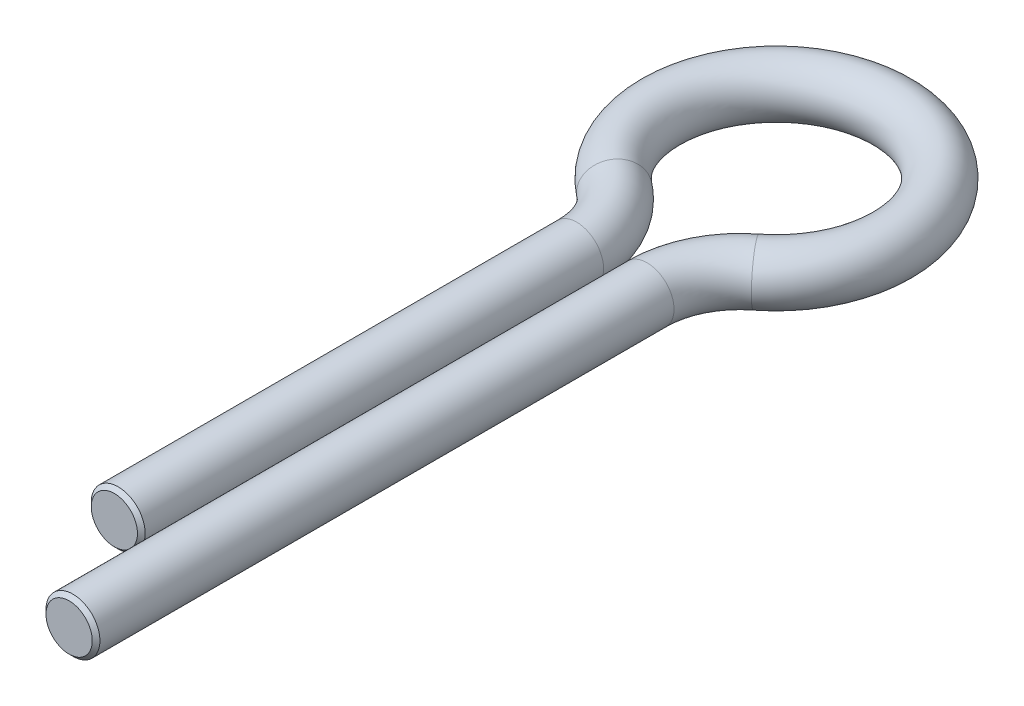
ISO-10303-21;
HEADER;
FILE_DESCRIPTION(('STEP AP214'),'2;1');
FILE_NAME('part.step','',(''),(''),'','','');
FILE_SCHEMA(('AUTOMOTIVE_DESIGN { 1 0 10303 214 1 1 1 1 }'));
ENDSEC;
DATA;
#1=APPLICATION_CONTEXT('core data for automotive mechanical design processes');
#2=APPLICATION_PROTOCOL_DEFINITION('international standard','automotive_design',2000,#1);
#3=PRODUCT_CONTEXT('',#1,'mechanical');
#4=PRODUCT('Part','Part','',(#3));
#5=PRODUCT_RELATED_PRODUCT_CATEGORY('part','',(#4));
#6=PRODUCT_DEFINITION_FORMATION('','',#4);
#7=PRODUCT_DEFINITION_CONTEXT('part definition',#1,'design');
#8=PRODUCT_DEFINITION('design','',#6,#7);
#9=PRODUCT_DEFINITION_SHAPE('','',#8);
#10=(LENGTH_UNIT() NAMED_UNIT(*) SI_UNIT(.MILLI.,.METRE.));
#11=(NAMED_UNIT(*) PLANE_ANGLE_UNIT() SI_UNIT($,.RADIAN.));
#12=(NAMED_UNIT(*) SI_UNIT($,.STERADIAN.) SOLID_ANGLE_UNIT());
#13=UNCERTAINTY_MEASURE_WITH_UNIT(LENGTH_MEASURE(1.E-05),#10,'distance_accuracy_value','');
#14=(GEOMETRIC_REPRESENTATION_CONTEXT(3) GLOBAL_UNCERTAINTY_ASSIGNED_CONTEXT((#13)) GLOBAL_UNIT_ASSIGNED_CONTEXT((#10,
#11,#12)) REPRESENTATION_CONTEXT('',''));
#15=CARTESIAN_POINT('',(0.,0.,0.));
#16=DIRECTION('',(0.,0.,1.));
#17=DIRECTION('',(1.,0.,0.));
#18=AXIS2_PLACEMENT_3D('',#15,#16,#17);
#19=CARTESIAN_POINT('',(0.912834636672157,0.,9.7742219057031));
#20=DIRECTION('',(0.,0.,-1.));
#21=DIRECTION('',(-1.,0.,0.));
#22=AXIS2_PLACEMENT_3D('',#19,#20,#21);
#23=PLANE('',#22);
#24=CARTESIAN_POINT('',(0.912834636672157,0.,9.7742219057031));
#25=DIRECTION('',(0.,0.,-1.));
#26=DIRECTION('',(-1.,0.,0.));
#27=AXIS2_PLACEMENT_3D('',#24,#25,#26);
#28=CIRCLE('',#27,0.599999999999996);
#29=CARTESIAN_POINT('',(0.312834636672161,0.,9.7742219057031));
#30=VERTEX_POINT('',#29);
#31=EDGE_CURVE('E10',#30,#30,#28,.F.);
#32=ORIENTED_EDGE('',*,*,#31,.T.);
#33=EDGE_LOOP('',(#32));
#34=FACE_BOUND('',#33,.T.);
#35=ADVANCED_FACE('F50',(#34),#23,.F.);
#36=CARTESIAN_POINT('',(-0.912834636672154,0.,6.77422190570311));
#37=DIRECTION('',(0.,0.,1.));
#38=DIRECTION('',(1.,0.,0.));
#39=AXIS2_PLACEMENT_3D('',#36,#37,#38);
#40=PLANE('',#39);
#41=CARTESIAN_POINT('',(-0.912834636672154,0.,6.77422190570311));
#42=DIRECTION('',(0.,0.,1.));
#43=DIRECTION('',(1.,0.,0.));
#44=AXIS2_PLACEMENT_3D('',#41,#42,#43);
#45=CIRCLE('',#44,0.600000000000003);
#46=CARTESIAN_POINT('',(-0.31283463667215,0.,6.77422190570311));
#47=VERTEX_POINT('',#46);
#48=EDGE_CURVE('E61',#47,#47,#45,.T.);
#49=ORIENTED_EDGE('',*,*,#48,.T.);
#50=EDGE_LOOP('',(#49));
#51=FACE_BOUND('',#50,.T.);
#52=ADVANCED_FACE('F108',(#51),#40,.T.);
#53=CARTESIAN_POINT('',(0.912834636672155,0.,-5.2257780942969));
#54=DIRECTION('',(0.,0.,1.));
#55=DIRECTION('',(1.,0.,0.));
#56=AXIS2_PLACEMENT_3D('',#53,#54,#55);
#57=CYLINDRICAL_SURFACE('',#56,0.7);
#58=CARTESIAN_POINT('',(0.912834636672157,0.,9.6742219057031));
#59=DIRECTION('',(0.,0.,-1.));
#60=DIRECTION('',(-1.,0.,0.));
#61=AXIS2_PLACEMENT_3D('',#58,#59,#60);
#62=CIRCLE('',#61,0.7);
#63=CARTESIAN_POINT('',(0.212834636672157,0.,9.6742219057031));
#64=VERTEX_POINT('',#63);
#65=EDGE_CURVE('E54',#64,#64,#62,.T.);
#66=ORIENTED_EDGE('',*,*,#65,.T.);
#67=EDGE_LOOP('',(#66));
#68=FACE_BOUND('',#67,.T.);
#69=CARTESIAN_POINT('',(0.912834636672155,0.,-5.2257780942969));
#70=DIRECTION('',(-0.00415160643904387,0.,-0.999991382044853));
#71=DIRECTION('',(-0.999991382044853,0.,0.00415160643904387));
#72=AXIS2_PLACEMENT_3D('',#69,#70,#71);
#73=CIRCLE('',#72,0.7);
#74=CARTESIAN_POINT('',(0.212840669240758,0.,-5.22287196978957));
#75=VERTEX_POINT('',#74);
#76=EDGE_CURVE('E69',#75,#75,#73,.T.);
#77=ORIENTED_EDGE('',*,*,#76,.F.);
#78=EDGE_LOOP('',(#77));
#79=FACE_BOUND('',#78,.T.);
#80=ADVANCED_FACE('F102',(#68,#79),#57,.T.);
#81=CARTESIAN_POINT('',(-3.3124892430701,0.,-5.23574060166874));
#82=DIRECTION('',(0.,1.,0.));
#83=DIRECTION('',(0.,0.,1.));
#84=AXIS2_PLACEMENT_3D('',#81,#82,#83);
#85=TOROIDAL_SURFACE('',#84,2.39967528669193,0.7);
#86=CARTESIAN_POINT('',(-1.84038246775731,0.,-7.13082453744526));
#87=DIRECTION('',(0.789725154184913,0.,0.613460822585774));
#88=DIRECTION('',(0.613460822585774,0.,-0.789725154184913));
#89=AXIS2_PLACEMENT_3D('',#86,#87,#88);
#90=CIRCLE('',#89,0.7);
#91=CARTESIAN_POINT('',(-2.26980504356735,0.,-6.57801692951581));
#92=VERTEX_POINT('',#91);
#93=EDGE_CURVE('E158',#92,#92,#90,.T.);
#94=ORIENTED_EDGE('',*,*,#93,.T.);
#95=EDGE_LOOP('',(#94));
#96=FACE_BOUND('',#95,.T.);
#97=CARTESIAN_POINT('',(-0.912834636672153,0.,-5.22577809429689));
#98=DIRECTION('',(0.,0.,1.));
#99=DIRECTION('',(1.,0.,0.));
#100=AXIS2_PLACEMENT_3D('',#97,#98,#99);
#101=CIRCLE('',#100,0.7);
#102=CARTESIAN_POINT('',(-0.212834636672153,0.,-5.22577809429689));
#103=VERTEX_POINT('',#102);
#104=EDGE_CURVE('E66',#103,#103,#101,.T.);
#105=ORIENTED_EDGE('',*,*,#104,.F.);
#106=EDGE_LOOP('',(#105));
#107=FACE_BOUND('',#106,.T.);
#108=ADVANCED_FACE('F103',(#96,#107),#85,.T.);
#109=CARTESIAN_POINT('',(0.,0.,-9.5));
#110=DIRECTION('',(0.,-1.,0.));
#111=DIRECTION('',(0.,0.,-1.));
#112=AXIS2_PLACEMENT_3D('',#109,#110,#111);
#113=TOROIDAL_SURFACE('',#112,3.,0.7);
#114=CARTESIAN_POINT('',(1.84038246775732,0.,-7.13082453744526));
#115=DIRECTION('',(0.789725154184914,0.,-0.613460822585773));
#116=DIRECTION('',(-0.613460822585773,0.,-0.789725154184914));
#117=AXIS2_PLACEMENT_3D('',#114,#115,#116);
#118=CIRCLE('',#117,0.7);
#119=CARTESIAN_POINT('',(2.26980504356736,0.,-6.57801692951582));
#120=VERTEX_POINT('',#119);
#121=EDGE_CURVE('E75',#120,#120,#118,.T.);
#122=CARTESIAN_POINT('',(0.,0.,-9.5));
#123=DIRECTION('',(0.,-1.,0.));
#124=DIRECTION('',(0.,0.,-1.));
#125=AXIS2_PLACEMENT_3D('',#122,#123,#124);
#126=CIRCLE('',#125,3.7);
#127=EDGE_CURVE('',#92,#120,#126,.T.);
#128=ORIENTED_EDGE('',*,*,#93,.F.);
#129=ORIENTED_EDGE('',*,*,#121,.T.);
#130=ORIENTED_EDGE('',*,*,#127,.T.);
#131=ORIENTED_EDGE('',*,*,#127,.F.);
#132=EDGE_LOOP('',(#128,#130,#129,#131));
#133=FACE_BOUND('',#132,.T.);
#134=ADVANCED_FACE('F98',(#133),#113,.T.);
#135=CARTESIAN_POINT('',(3.3124892430701,0.,-5.23574060166874));
#136=DIRECTION('',(0.,1.,0.));
#137=DIRECTION('',(0.,0.,1.));
#138=AXIS2_PLACEMENT_3D('',#135,#136,#137);
#139=TOROIDAL_SURFACE('',#138,2.39967528669193,0.7);
#140=ORIENTED_EDGE('',*,*,#76,.T.);
#141=EDGE_LOOP('',(#140));
#142=FACE_BOUND('',#141,.T.);
#143=ORIENTED_EDGE('',*,*,#121,.F.);
#144=EDGE_LOOP('',(#143));
#145=FACE_BOUND('',#144,.T.);
#146=ADVANCED_FACE('F87',(#142,#145),#139,.T.);
#147=CARTESIAN_POINT('',(-0.912834636672154,0.,6.77422190570311));
#148=DIRECTION('',(0.,0.,-1.));
#149=DIRECTION('',(-1.,0.,0.));
#150=AXIS2_PLACEMENT_3D('',#147,#148,#149);
#151=CYLINDRICAL_SURFACE('',#150,0.7);
#152=CARTESIAN_POINT('',(-0.912834636672154,0.,6.67422190570311));
#153=DIRECTION('',(0.,0.,1.));
#154=DIRECTION('',(1.,0.,0.));
#155=AXIS2_PLACEMENT_3D('',#152,#153,#154);
#156=CIRCLE('',#155,0.7);
#157=CARTESIAN_POINT('',(-0.212834636672154,0.,6.67422190570311));
#158=VERTEX_POINT('',#157);
#159=EDGE_CURVE('E56',#158,#158,#156,.F.);
#160=ORIENTED_EDGE('',*,*,#159,.T.);
#161=EDGE_LOOP('',(#160));
#162=FACE_BOUND('',#161,.T.);
#163=ORIENTED_EDGE('',*,*,#104,.T.);
#164=EDGE_LOOP('',(#163));
#165=FACE_BOUND('',#164,.T.);
#166=ADVANCED_FACE('F97',(#162,#165),#151,.T.);
#167=CARTESIAN_POINT('',(-0.912834636672154,0.,6.77422190570311));
#168=DIRECTION('',(0.,0.,-1.));
#169=DIRECTION('',(-1.,0.,0.));
#170=AXIS2_PLACEMENT_3D('',#167,#168,#169);
#171=CONICAL_SURFACE('',#170,0.600000000000003,0.785398163397432);
#172=ORIENTED_EDGE('',*,*,#159,.F.);
#173=EDGE_LOOP('',(#172));
#174=FACE_BOUND('',#173,.T.);
#175=ORIENTED_EDGE('',*,*,#48,.F.);
#176=EDGE_LOOP('',(#175));
#177=FACE_BOUND('',#176,.T.);
#178=ADVANCED_FACE('F112',(#174,#177),#171,.T.);
#179=CARTESIAN_POINT('',(0.912834636672157,0.,9.6742219057031));
#180=DIRECTION('',(0.,0.,-1.));
#181=DIRECTION('',(-1.,0.,0.));
#182=AXIS2_PLACEMENT_3D('',#179,#180,#181);
#183=CONICAL_SURFACE('',#182,0.7,0.785398163397453);
#184=ORIENTED_EDGE('',*,*,#31,.F.);
#185=EDGE_LOOP('',(#184));
#186=FACE_BOUND('',#185,.T.);
#187=ORIENTED_EDGE('',*,*,#65,.F.);
#188=EDGE_LOOP('',(#187));
#189=FACE_BOUND('',#188,.T.);
#190=ADVANCED_FACE('F49',(#186,#189),#183,.T.);
#191=CLOSED_SHELL('',(#35,#52,#80,#108,#134,#146,#166,#178,#190));
#192=MANIFOLD_SOLID_BREP('B2',#191);
#193=ADVANCED_BREP_SHAPE_REPRESENTATION('',(#18,#192),#14);
#194=SHAPE_DEFINITION_REPRESENTATION(#9,#193);
ENDSEC;
END-ISO-10303-21;
